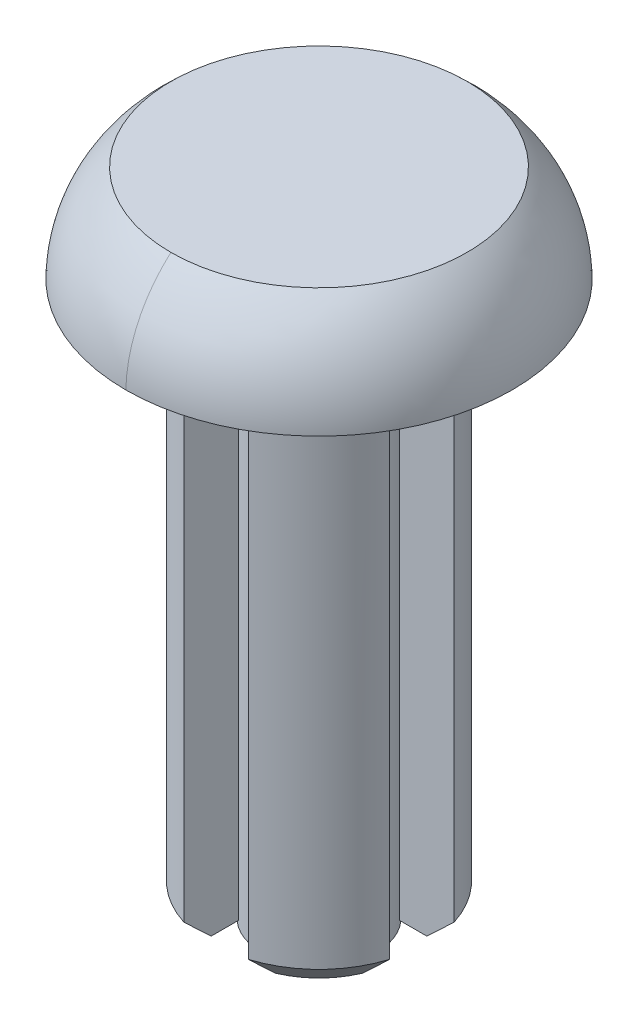
ISO-10303-21;
HEADER;
FILE_DESCRIPTION(('STEP AP214'),'2;1');
FILE_NAME('part.step','',(''),(''),'','','');
FILE_SCHEMA(('AUTOMOTIVE_DESIGN { 1 0 10303 214 1 1 1 1 }'));
ENDSEC;
DATA;
#1=APPLICATION_CONTEXT('core data for automotive mechanical design processes');
#2=APPLICATION_PROTOCOL_DEFINITION('international standard','automotive_design',2000,#1);
#3=PRODUCT_CONTEXT('',#1,'mechanical');
#4=PRODUCT('Part','Part','',(#3));
#5=PRODUCT_RELATED_PRODUCT_CATEGORY('part','',(#4));
#6=PRODUCT_DEFINITION_FORMATION('','',#4);
#7=PRODUCT_DEFINITION_CONTEXT('part definition',#1,'design');
#8=PRODUCT_DEFINITION('design','',#6,#7);
#9=PRODUCT_DEFINITION_SHAPE('','',#8);
#10=(LENGTH_UNIT() NAMED_UNIT(*) SI_UNIT(.MILLI.,.METRE.));
#11=(NAMED_UNIT(*) PLANE_ANGLE_UNIT() SI_UNIT($,.RADIAN.));
#12=(NAMED_UNIT(*) SI_UNIT($,.STERADIAN.) SOLID_ANGLE_UNIT());
#13=UNCERTAINTY_MEASURE_WITH_UNIT(LENGTH_MEASURE(1.E-05),#10,'distance_accuracy_value','');
#14=(GEOMETRIC_REPRESENTATION_CONTEXT(3) GLOBAL_UNCERTAINTY_ASSIGNED_CONTEXT((#13)) GLOBAL_UNIT_ASSIGNED_CONTEXT((#10,
#11,#12)) REPRESENTATION_CONTEXT('',''));
#15=CARTESIAN_POINT('',(0.,0.,0.));
#16=DIRECTION('',(0.,0.,1.));
#17=DIRECTION('',(1.,0.,0.));
#18=AXIS2_PLACEMENT_3D('',#15,#16,#17);
#19=CARTESIAN_POINT('',(0.,-11.4394,0.));
#20=DIRECTION('',(0.,1.,0.));
#21=DIRECTION('',(0.,0.,1.));
#22=AXIS2_PLACEMENT_3D('',#19,#20,#21);
#23=CONICAL_SURFACE('',#22,0.635,0.785398163397446);
#24=DIRECTION('',(0.,0.707106781186549,-0.707106781186546));
#25=VECTOR('',#24,1.);
#26=CARTESIAN_POINT('',(0.,-11.4394,-0.635));
#27=LINE('',#26,#25);
#28=CARTESIAN_POINT('',(0.,-11.4394,-0.635));
#29=VERTEX_POINT('',#28);
#30=CARTESIAN_POINT('',(0.,-10.9314,-1.143));
#31=VERTEX_POINT('',#30);
#32=EDGE_CURVE('E45',#29,#31,#27,.T.);
#33=ORIENTED_EDGE('',*,*,#32,.F.);
#34=CARTESIAN_POINT('',(0.,-11.4394,0.));
#35=DIRECTION('',(0.,-1.,0.));
#36=DIRECTION('',(0.,0.,-1.));
#37=AXIS2_PLACEMENT_3D('',#34,#35,#36);
#38=CIRCLE('',#37,0.635);
#39=CARTESIAN_POINT('',(0.,-11.4394,0.635));
#40=VERTEX_POINT('',#39);
#41=EDGE_CURVE('E30',#40,#29,#38,.T.);
#42=ORIENTED_EDGE('',*,*,#41,.F.);
#43=DIRECTION('',(0.,0.707106781186549,0.707106781186546));
#44=VECTOR('',#43,1.);
#45=CARTESIAN_POINT('',(0.,-11.4394,0.635));
#46=LINE('',#45,#44);
#47=CARTESIAN_POINT('',(0.,-10.9314,1.143));
#48=VERTEX_POINT('',#47);
#49=EDGE_CURVE('E10',#40,#48,#46,.T.);
#50=ORIENTED_EDGE('',*,*,#49,.T.);
#51=CARTESIAN_POINT('',(0.,-10.9314,0.));
#52=DIRECTION('',(0.,1.,0.));
#53=DIRECTION('',(0.,0.,-1.));
#54=AXIS2_PLACEMENT_3D('',#51,#52,#53);
#55=CIRCLE('',#54,1.143);
#56=EDGE_CURVE('E375',#31,#48,#55,.T.);
#57=ORIENTED_EDGE('',*,*,#56,.F.);
#58=EDGE_LOOP('',(#33,#42,#50,#57));
#59=FACE_BOUND('',#58,.T.);
#60=ADVANCED_FACE('F16',(#59),#23,.T.);
#61=CARTESIAN_POINT('',(0.,-11.4394,0.));
#62=DIRECTION('',(0.,-1.,0.));
#63=DIRECTION('',(0.,0.,-1.));
#64=AXIS2_PLACEMENT_3D('',#61,#62,#63);
#65=PLANE('',#64);
#66=ORIENTED_EDGE('',*,*,#41,.T.);
#67=CARTESIAN_POINT('',(0.,-11.4394,0.));
#68=DIRECTION('',(0.,-1.,0.));
#69=DIRECTION('',(0.,0.,-1.));
#70=AXIS2_PLACEMENT_3D('',#67,#68,#69);
#71=CIRCLE('',#70,0.635);
#72=EDGE_CURVE('E357',#29,#40,#71,.T.);
#73=ORIENTED_EDGE('',*,*,#72,.T.);
#74=EDGE_LOOP('',(#66,#73));
#75=FACE_BOUND('',#74,.T.);
#76=ADVANCED_FACE('F563',(#75),#65,.T.);
#77=CARTESIAN_POINT('',(0.,-11.4394,0.));
#78=DIRECTION('',(0.,1.,0.));
#79=DIRECTION('',(0.,0.,1.));
#80=AXIS2_PLACEMENT_3D('',#77,#78,#79);
#81=CYLINDRICAL_SURFACE('',#80,1.143);
#82=DIRECTION('',(0.,1.,0.));
#83=VECTOR('',#82,1.);
#84=CARTESIAN_POINT('',(0.,-11.4394,-1.143));
#85=LINE('',#84,#83);
#86=CARTESIAN_POINT('',(0.,-0.6444,-1.143));
#87=VERTEX_POINT('',#86);
#88=EDGE_CURVE('E394',#31,#87,#85,.T.);
#89=ORIENTED_EDGE('',*,*,#88,.F.);
#90=ORIENTED_EDGE('',*,*,#56,.T.);
#91=DIRECTION('',(0.,1.,0.));
#92=VECTOR('',#91,1.);
#93=CARTESIAN_POINT('',(0.,-11.4394,1.143));
#94=LINE('',#93,#92);
#95=CARTESIAN_POINT('',(0.,-0.6444,1.143));
#96=VERTEX_POINT('',#95);
#97=EDGE_CURVE('E376',#48,#96,#94,.T.);
#98=ORIENTED_EDGE('',*,*,#97,.T.);
#99=CARTESIAN_POINT('',(0.,-0.6444,0.));
#100=DIRECTION('',(0.,1.,0.));
#101=DIRECTION('',(0.,0.,-1.));
#102=AXIS2_PLACEMENT_3D('',#99,#100,#101);
#103=CIRCLE('',#102,1.143);
#104=CARTESIAN_POINT('',(-0.635,-0.6444,0.950380976240581));
#105=VERTEX_POINT('',#104);
#106=EDGE_CURVE('E414',#105,#96,#103,.T.);
#107=ORIENTED_EDGE('',*,*,#106,.F.);
#108=DIRECTION('',(0.,-1.,0.));
#109=VECTOR('',#108,1.);
#110=CARTESIAN_POINT('',(-0.635,-11.4394,0.950380976240581));
#111=LINE('',#110,#109);
#112=CARTESIAN_POINT('',(-0.635,-10.8044,0.950380976240581));
#113=VERTEX_POINT('',#112);
#114=EDGE_CURVE('E419',#105,#113,#111,.T.);
#115=ORIENTED_EDGE('',*,*,#114,.T.);
#116=CARTESIAN_POINT('',(0.,-10.8044,0.));
#117=DIRECTION('',(0.,1.,0.));
#118=DIRECTION('',(0.,0.,-1.));
#119=AXIS2_PLACEMENT_3D('',#116,#117,#118);
#120=CIRCLE('',#119,1.143);
#121=CARTESIAN_POINT('',(-0.950380976240581,-10.8044,0.635));
#122=VERTEX_POINT('',#121);
#123=EDGE_CURVE('E412',#122,#113,#120,.T.);
#124=ORIENTED_EDGE('',*,*,#123,.F.);
#125=DIRECTION('',(0.,1.,0.));
#126=VECTOR('',#125,1.);
#127=CARTESIAN_POINT('',(-0.950380976240581,-11.4394,0.635));
#128=LINE('',#127,#126);
#129=CARTESIAN_POINT('',(-0.950380976240581,-0.6444,0.635));
#130=VERTEX_POINT('',#129);
#131=EDGE_CURVE('E424',#122,#130,#128,.T.);
#132=ORIENTED_EDGE('',*,*,#131,.T.);
#133=CARTESIAN_POINT('',(0.,-0.6444,0.));
#134=DIRECTION('',(0.,1.,0.));
#135=DIRECTION('',(0.,0.,-1.));
#136=AXIS2_PLACEMENT_3D('',#133,#134,#135);
#137=CIRCLE('',#136,1.143);
#138=CARTESIAN_POINT('',(-0.950380976240581,-0.6444,-0.635));
#139=VERTEX_POINT('',#138);
#140=EDGE_CURVE('E340',#139,#130,#137,.T.);
#141=ORIENTED_EDGE('',*,*,#140,.F.);
#142=DIRECTION('',(0.,-1.,0.));
#143=VECTOR('',#142,1.);
#144=CARTESIAN_POINT('',(-0.950380976240581,-11.4394,-0.635));
#145=LINE('',#144,#143);
#146=CARTESIAN_POINT('',(-0.950380976240581,-10.8044,-0.635));
#147=VERTEX_POINT('',#146);
#148=EDGE_CURVE('E333',#139,#147,#145,.T.);
#149=ORIENTED_EDGE('',*,*,#148,.T.);
#150=CARTESIAN_POINT('',(0.,-10.8044,0.));
#151=DIRECTION('',(0.,1.,0.));
#152=DIRECTION('',(0.,0.,-1.));
#153=AXIS2_PLACEMENT_3D('',#150,#151,#152);
#154=CIRCLE('',#153,1.143);
#155=CARTESIAN_POINT('',(-0.635,-10.8044,-0.950380976240581));
#156=VERTEX_POINT('',#155);
#157=EDGE_CURVE('E389',#156,#147,#154,.T.);
#158=ORIENTED_EDGE('',*,*,#157,.F.);
#159=DIRECTION('',(0.,1.,0.));
#160=VECTOR('',#159,1.);
#161=CARTESIAN_POINT('',(-0.635,-11.4394,-0.950380976240581));
#162=LINE('',#161,#160);
#163=CARTESIAN_POINT('',(-0.635,-0.6444,-0.950380976240581));
#164=VERTEX_POINT('',#163);
#165=EDGE_CURVE('E757',#156,#164,#162,.T.);
#166=ORIENTED_EDGE('',*,*,#165,.T.);
#167=CARTESIAN_POINT('',(0.,-0.6444,0.));
#168=DIRECTION('',(0.,1.,0.));
#169=DIRECTION('',(0.,0.,-1.));
#170=AXIS2_PLACEMENT_3D('',#167,#168,#169);
#171=CIRCLE('',#170,1.143);
#172=EDGE_CURVE('E356',#87,#164,#171,.T.);
#173=ORIENTED_EDGE('',*,*,#172,.F.);
#174=EDGE_LOOP('',(#89,#90,#98,#107,#115,#124,#132,#141,#149,#158,#166,#173));
#175=FACE_BOUND('',#174,.T.);
#176=ADVANCED_FACE('F566',(#175),#81,.T.);
#177=CARTESIAN_POINT('',(0.,-11.4394,0.));
#178=DIRECTION('',(0.,1.,0.));
#179=DIRECTION('',(0.,0.,1.));
#180=AXIS2_PLACEMENT_3D('',#177,#178,#179);
#181=CONICAL_SURFACE('',#180,0.635,0.785398163397446);
#182=ORIENTED_EDGE('',*,*,#72,.F.);
#183=ORIENTED_EDGE('',*,*,#32,.T.);
#184=CARTESIAN_POINT('',(0.,-10.9314,0.));
#185=DIRECTION('',(0.,1.,0.));
#186=DIRECTION('',(0.,0.,-1.));
#187=AXIS2_PLACEMENT_3D('',#184,#185,#186);
#188=CIRCLE('',#187,1.143);
#189=EDGE_CURVE('E398',#48,#31,#188,.T.);
#190=ORIENTED_EDGE('',*,*,#189,.F.);
#191=ORIENTED_EDGE('',*,*,#49,.F.);
#192=EDGE_LOOP('',(#182,#183,#190,#191));
#193=FACE_BOUND('',#192,.T.);
#194=ADVANCED_FACE('F483',(#193),#181,.T.);
#195=CARTESIAN_POINT('',(-0.635,-0.6444,-0.635));
#196=DIRECTION('',(-1.,0.,0.));
#197=DIRECTION('',(0.,0.,1.));
#198=AXIS2_PLACEMENT_3D('',#195,#196,#197);
#199=PLANE('',#198);
#200=DIRECTION('',(0.,0.,-1.));
#201=VECTOR('',#200,1.);
#202=CARTESIAN_POINT('',(-0.635,-10.8044,-0.635));
#203=LINE('',#202,#201);
#204=CARTESIAN_POINT('',(-0.635,-10.8044,-1.48954542142898));
#205=VERTEX_POINT('',#204);
#206=EDGE_CURVE('E759',#156,#205,#203,.T.);
#207=ORIENTED_EDGE('',*,*,#206,.T.);
#208=CARTESIAN_POINT('',(-0.635,-10.8044,-1.48954542142898));
#209=CARTESIAN_POINT('',(-0.635,-10.5894198082781,-1.72324536131516));
#210=CARTESIAN_POINT('',(-0.635,-10.2964,-2.03026292940102));
#211=B_SPLINE_CURVE_WITH_KNOTS('',2,(#208,#209,#210),.UNSPECIFIED.,.F.,.F.,(3,3),(0.,1.),.UNSPECIFIED.);
#212=CARTESIAN_POINT('',(-0.635,-10.2964,-2.03026292940102));
#213=VERTEX_POINT('',#212);
#214=EDGE_CURVE('E466',#205,#213,#211,.T.);
#215=ORIENTED_EDGE('',*,*,#214,.T.);
#216=DIRECTION('',(0.,-1.,0.));
#217=VECTOR('',#216,1.);
#218=CARTESIAN_POINT('',(-0.635,-0.6444,-2.03026292940102));
#219=LINE('',#218,#217);
#220=CARTESIAN_POINT('',(-0.635,-0.6444,-2.03026292940102));
#221=VERTEX_POINT('',#220);
#222=EDGE_CURVE('E436',#221,#213,#219,.T.);
#223=ORIENTED_EDGE('',*,*,#222,.F.);
#224=DIRECTION('',(0.,0.,-1.));
#225=VECTOR('',#224,1.);
#226=CARTESIAN_POINT('',(-0.635,-0.6444,-0.635));
#227=LINE('',#226,#225);
#228=EDGE_CURVE('E400',#164,#221,#227,.T.);
#229=ORIENTED_EDGE('',*,*,#228,.F.);
#230=ORIENTED_EDGE('',*,*,#165,.F.);
#231=EDGE_LOOP('',(#207,#215,#223,#229,#230));
#232=FACE_BOUND('',#231,.T.);
#233=ADVANCED_FACE('F471',(#232),#199,.F.);
#234=CARTESIAN_POINT('',(0.,-0.6444,0.));
#235=DIRECTION('',(0.,-1.,0.));
#236=DIRECTION('',(0.,0.,-1.));
#237=AXIS2_PLACEMENT_3D('',#234,#235,#236);
#238=PLANE('',#237);
#239=DIRECTION('',(1.,0.,0.));
#240=VECTOR('',#239,1.);
#241=CARTESIAN_POINT('',(-2.03026292940101,-0.6444,-0.635));
#242=LINE('',#241,#240);
#243=CARTESIAN_POINT('',(-2.03026292940101,-0.6444,-0.635));
#244=VERTEX_POINT('',#243);
#245=EDGE_CURVE('E685',#244,#139,#242,.T.);
#246=ORIENTED_EDGE('',*,*,#245,.T.);
#247=ORIENTED_EDGE('',*,*,#140,.T.);
#248=DIRECTION('',(-1.,0.,0.));
#249=VECTOR('',#248,1.);
#250=CARTESIAN_POINT('',(-2.03026292940101,-0.6444,0.635));
#251=LINE('',#250,#249);
#252=CARTESIAN_POINT('',(-2.03026292940101,-0.6444,0.635));
#253=VERTEX_POINT('',#252);
#254=EDGE_CURVE('E337',#130,#253,#251,.T.);
#255=ORIENTED_EDGE('',*,*,#254,.T.);
#256=CARTESIAN_POINT('',(0.,-0.6444,0.));
#257=DIRECTION('',(0.,-1.,0.));
#258=DIRECTION('',(0.,0.,-1.));
#259=AXIS2_PLACEMENT_3D('',#256,#257,#258);
#260=CIRCLE('',#259,2.12725);
#261=EDGE_CURVE('E343',#253,#244,#260,.T.);
#262=ORIENTED_EDGE('',*,*,#261,.T.);
#263=EDGE_LOOP('',(#246,#247,#255,#262));
#264=FACE_BOUND('',#263,.T.);
#265=ADVANCED_FACE('F294',(#264),#238,.T.);
#266=CARTESIAN_POINT('',(-2.03026292940101,-0.6444,-0.635));
#267=DIRECTION('',(0.,0.,-1.));
#268=DIRECTION('',(0.,-1.,0.));
#269=AXIS2_PLACEMENT_3D('',#266,#267,#268);
#270=PLANE('',#269);
#271=DIRECTION('',(0.,-1.,0.));
#272=VECTOR('',#271,1.);
#273=CARTESIAN_POINT('',(-2.03026292940101,-0.6444,-0.635));
#274=LINE('',#273,#272);
#275=CARTESIAN_POINT('',(-2.03026292940101,-10.2964,-0.635));
#276=VERTEX_POINT('',#275);
#277=EDGE_CURVE('E438',#244,#276,#274,.T.);
#278=ORIENTED_EDGE('',*,*,#277,.T.);
#279=CARTESIAN_POINT('',(-2.03026292940101,-10.2964,-0.635));
#280=CARTESIAN_POINT('',(-1.72324536131495,-10.5894198082783,-0.635));
#281=CARTESIAN_POINT('',(-1.48954542142898,-10.8044,-0.635));
#282=B_SPLINE_CURVE_WITH_KNOTS('',2,(#279,#280,#281),.UNSPECIFIED.,.F.,.F.,(3,3),(0.,1.),.UNSPECIFIED.);
#283=CARTESIAN_POINT('',(-1.48954542142898,-10.8044,-0.635));
#284=VERTEX_POINT('',#283);
#285=EDGE_CURVE('E601',#276,#284,#282,.T.);
#286=ORIENTED_EDGE('',*,*,#285,.T.);
#287=DIRECTION('',(1.,0.,0.));
#288=VECTOR('',#287,1.);
#289=CARTESIAN_POINT('',(-2.03026292940101,-10.8044,-0.635));
#290=LINE('',#289,#288);
#291=EDGE_CURVE('E435',#284,#147,#290,.T.);
#292=ORIENTED_EDGE('',*,*,#291,.T.);
#293=ORIENTED_EDGE('',*,*,#148,.F.);
#294=ORIENTED_EDGE('',*,*,#245,.F.);
#295=EDGE_LOOP('',(#278,#286,#292,#293,#294));
#296=FACE_BOUND('',#295,.T.);
#297=ADVANCED_FACE('F555',(#296),#270,.F.);
#298=CARTESIAN_POINT('',(0.,-0.6444,0.));
#299=DIRECTION('',(0.,-1.,0.));
#300=DIRECTION('',(0.,0.,-1.));
#301=AXIS2_PLACEMENT_3D('',#298,#299,#300);
#302=PLANE('',#301);
#303=DIRECTION('',(0.,0.,1.));
#304=VECTOR('',#303,1.);
#305=CARTESIAN_POINT('',(0.635,-0.6444,-0.635));
#306=LINE('',#305,#304);
#307=CARTESIAN_POINT('',(0.635,-0.6444,-2.03026292940101));
#308=VERTEX_POINT('',#307);
#309=CARTESIAN_POINT('',(0.635,-0.6444,-0.950380976240581));
#310=VERTEX_POINT('',#309);
#311=EDGE_CURVE('E354',#308,#310,#306,.T.);
#312=ORIENTED_EDGE('',*,*,#311,.T.);
#313=CARTESIAN_POINT('',(0.,-0.6444,0.));
#314=DIRECTION('',(0.,1.,0.));
#315=DIRECTION('',(0.,0.,-1.));
#316=AXIS2_PLACEMENT_3D('',#313,#314,#315);
#317=CIRCLE('',#316,1.143);
#318=EDGE_CURVE('E351',#310,#87,#317,.T.);
#319=ORIENTED_EDGE('',*,*,#318,.T.);
#320=ORIENTED_EDGE('',*,*,#172,.T.);
#321=ORIENTED_EDGE('',*,*,#228,.T.);
#322=CARTESIAN_POINT('',(0.,-0.6444,0.));
#323=DIRECTION('',(0.,-1.,0.));
#324=DIRECTION('',(0.,0.,-1.));
#325=AXIS2_PLACEMENT_3D('',#322,#323,#324);
#326=CIRCLE('',#325,2.12725);
#327=CARTESIAN_POINT('',(0.,-0.6444,-2.12725));
#328=VERTEX_POINT('',#327);
#329=EDGE_CURVE('E379',#221,#328,#326,.T.);
#330=ORIENTED_EDGE('',*,*,#329,.T.);
#331=CARTESIAN_POINT('',(0.,-0.6444,0.));
#332=DIRECTION('',(0.,-1.,0.));
#333=DIRECTION('',(0.,0.,-1.));
#334=AXIS2_PLACEMENT_3D('',#331,#332,#333);
#335=CIRCLE('',#334,2.12725);
#336=EDGE_CURVE('E380',#328,#308,#335,.T.);
#337=ORIENTED_EDGE('',*,*,#336,.T.);
#338=EDGE_LOOP('',(#312,#319,#320,#321,#330,#337));
#339=FACE_BOUND('',#338,.T.);
#340=ADVANCED_FACE('F630',(#339),#302,.T.);
#341=CARTESIAN_POINT('',(-2.03026292940101,-0.6444,0.635));
#342=DIRECTION('',(0.,0.,1.));
#343=DIRECTION('',(1.,0.,0.));
#344=AXIS2_PLACEMENT_3D('',#341,#342,#343);
#345=PLANE('',#344);
#346=DIRECTION('',(-1.,0.,0.));
#347=VECTOR('',#346,1.);
#348=CARTESIAN_POINT('',(-2.03026292940101,-10.8044,0.635));
#349=LINE('',#348,#347);
#350=CARTESIAN_POINT('',(-1.48954542142898,-10.8044,0.635));
#351=VERTEX_POINT('',#350);
#352=EDGE_CURVE('E381',#122,#351,#349,.T.);
#353=ORIENTED_EDGE('',*,*,#352,.T.);
#354=CARTESIAN_POINT('',(-1.48954542142898,-10.8044,0.635));
#355=CARTESIAN_POINT('',(-1.72324536131537,-10.5894198082779,0.635));
#356=CARTESIAN_POINT('',(-2.03026292940101,-10.2964,0.635));
#357=B_SPLINE_CURVE_WITH_KNOTS('',2,(#354,#355,#356),.UNSPECIFIED.,.F.,.F.,(3,3),(0.,1.),.UNSPECIFIED.);
#358=CARTESIAN_POINT('',(-2.03026292940101,-10.2964,0.635));
#359=VERTEX_POINT('',#358);
#360=EDGE_CURVE('E518',#351,#359,#357,.T.);
#361=ORIENTED_EDGE('',*,*,#360,.T.);
#362=DIRECTION('',(0.,-1.,0.));
#363=VECTOR('',#362,1.);
#364=CARTESIAN_POINT('',(-2.03026292940101,-0.6444,0.635));
#365=LINE('',#364,#363);
#366=EDGE_CURVE('E651',#253,#359,#365,.T.);
#367=ORIENTED_EDGE('',*,*,#366,.F.);
#368=ORIENTED_EDGE('',*,*,#254,.F.);
#369=ORIENTED_EDGE('',*,*,#131,.F.);
#370=EDGE_LOOP('',(#353,#361,#367,#368,#369));
#371=FACE_BOUND('',#370,.T.);
#372=ADVANCED_FACE('F619',(#371),#345,.F.);
#373=CARTESIAN_POINT('',(-0.635,-0.6444,2.03026292940102));
#374=DIRECTION('',(-1.,0.,0.));
#375=DIRECTION('',(0.,1.,0.));
#376=AXIS2_PLACEMENT_3D('',#373,#374,#375);
#377=PLANE('',#376);
#378=DIRECTION('',(0.,-1.,0.));
#379=VECTOR('',#378,1.);
#380=CARTESIAN_POINT('',(-0.635,-0.6444,2.03026292940102));
#381=LINE('',#380,#379);
#382=CARTESIAN_POINT('',(-0.635,-0.6444,2.03026292940102));
#383=VERTEX_POINT('',#382);
#384=CARTESIAN_POINT('',(-0.635,-10.2964,2.03026292940102));
#385=VERTEX_POINT('',#384);
#386=EDGE_CURVE('E506',#383,#385,#381,.T.);
#387=ORIENTED_EDGE('',*,*,#386,.T.);
#388=CARTESIAN_POINT('',(-0.635,-10.2964,2.03026292940102));
#389=CARTESIAN_POINT('',(-0.635,-10.5894198082783,1.72324536131495));
#390=CARTESIAN_POINT('',(-0.635,-10.8044,1.48954542142898));
#391=B_SPLINE_CURVE_WITH_KNOTS('',2,(#388,#389,#390),.UNSPECIFIED.,.F.,.F.,(3,3),(0.,1.),.UNSPECIFIED.);
#392=CARTESIAN_POINT('',(-0.635,-10.8044,1.48954542142898));
#393=VERTEX_POINT('',#392);
#394=EDGE_CURVE('E519',#385,#393,#391,.T.);
#395=ORIENTED_EDGE('',*,*,#394,.T.);
#396=DIRECTION('',(0.,0.,-1.));
#397=VECTOR('',#396,1.);
#398=CARTESIAN_POINT('',(-0.635,-10.8044,2.03026292940102));
#399=LINE('',#398,#397);
#400=EDGE_CURVE('E420',#393,#113,#399,.T.);
#401=ORIENTED_EDGE('',*,*,#400,.T.);
#402=ORIENTED_EDGE('',*,*,#114,.F.);
#403=DIRECTION('',(0.,0.,-1.));
#404=VECTOR('',#403,1.);
#405=CARTESIAN_POINT('',(-0.635,-0.6444,2.03026292940102));
#406=LINE('',#405,#404);
#407=EDGE_CURVE('E409',#383,#105,#406,.T.);
#408=ORIENTED_EDGE('',*,*,#407,.F.);
#409=EDGE_LOOP('',(#387,#395,#401,#402,#408));
#410=FACE_BOUND('',#409,.T.);
#411=ADVANCED_FACE('F626',(#410),#377,.F.);
#412=CARTESIAN_POINT('',(0.,-11.4394,0.));
#413=DIRECTION('',(0.,1.,0.));
#414=DIRECTION('',(0.,0.,1.));
#415=AXIS2_PLACEMENT_3D('',#412,#413,#414);
#416=CYLINDRICAL_SURFACE('',#415,1.143);
#417=ORIENTED_EDGE('',*,*,#189,.T.);
#418=ORIENTED_EDGE('',*,*,#88,.T.);
#419=ORIENTED_EDGE('',*,*,#318,.F.);
#420=DIRECTION('',(0.,-1.,0.));
#421=VECTOR('',#420,1.);
#422=CARTESIAN_POINT('',(0.635,-11.4394,-0.950380976240581));
#423=LINE('',#422,#421);
#424=CARTESIAN_POINT('',(0.635,-10.8044,-0.950380976240581));
#425=VERTEX_POINT('',#424);
#426=EDGE_CURVE('E399',#310,#425,#423,.T.);
#427=ORIENTED_EDGE('',*,*,#426,.T.);
#428=CARTESIAN_POINT('',(0.,-10.8044,0.));
#429=DIRECTION('',(0.,1.,0.));
#430=DIRECTION('',(0.,0.,-1.));
#431=AXIS2_PLACEMENT_3D('',#428,#429,#430);
#432=CIRCLE('',#431,1.143);
#433=CARTESIAN_POINT('',(0.950380976240581,-10.8044,-0.635));
#434=VERTEX_POINT('',#433);
#435=EDGE_CURVE('E385',#434,#425,#432,.T.);
#436=ORIENTED_EDGE('',*,*,#435,.F.);
#437=DIRECTION('',(0.,1.,0.));
#438=VECTOR('',#437,1.);
#439=CARTESIAN_POINT('',(0.950380976240581,-11.4394,-0.635));
#440=LINE('',#439,#438);
#441=CARTESIAN_POINT('',(0.950380976240581,-0.6444,-0.635));
#442=VERTEX_POINT('',#441);
#443=EDGE_CURVE('E428',#434,#442,#440,.T.);
#444=ORIENTED_EDGE('',*,*,#443,.T.);
#445=CARTESIAN_POINT('',(0.,-0.6444,0.));
#446=DIRECTION('',(0.,1.,0.));
#447=DIRECTION('',(0.,0.,-1.));
#448=AXIS2_PLACEMENT_3D('',#445,#446,#447);
#449=CIRCLE('',#448,1.143);
#450=CARTESIAN_POINT('',(0.950380976240581,-0.6444,0.635));
#451=VERTEX_POINT('',#450);
#452=EDGE_CURVE('E345',#451,#442,#449,.T.);
#453=ORIENTED_EDGE('',*,*,#452,.F.);
#454=DIRECTION('',(0.,-1.,0.));
#455=VECTOR('',#454,1.);
#456=CARTESIAN_POINT('',(0.950380976240581,-11.4394,0.635));
#457=LINE('',#456,#455);
#458=CARTESIAN_POINT('',(0.950380976240581,-10.8044,0.635));
#459=VERTEX_POINT('',#458);
#460=EDGE_CURVE('E461',#451,#459,#457,.T.);
#461=ORIENTED_EDGE('',*,*,#460,.T.);
#462=CARTESIAN_POINT('',(0.,-10.8044,0.));
#463=DIRECTION('',(0.,1.,0.));
#464=DIRECTION('',(0.,0.,-1.));
#465=AXIS2_PLACEMENT_3D('',#462,#463,#464);
#466=CIRCLE('',#465,1.143);
#467=CARTESIAN_POINT('',(0.635,-10.8044,0.950380976240581));
#468=VERTEX_POINT('',#467);
#469=EDGE_CURVE('E688',#468,#459,#466,.T.);
#470=ORIENTED_EDGE('',*,*,#469,.F.);
#471=DIRECTION('',(0.,1.,0.));
#472=VECTOR('',#471,1.);
#473=CARTESIAN_POINT('',(0.635,-11.4394,0.950380976240581));
#474=LINE('',#473,#472);
#475=CARTESIAN_POINT('',(0.635,-0.6444,0.950380976240581));
#476=VERTEX_POINT('',#475);
#477=EDGE_CURVE('E735',#468,#476,#474,.T.);
#478=ORIENTED_EDGE('',*,*,#477,.T.);
#479=CARTESIAN_POINT('',(0.,-0.6444,0.));
#480=DIRECTION('',(0.,1.,0.));
#481=DIRECTION('',(0.,0.,-1.));
#482=AXIS2_PLACEMENT_3D('',#479,#480,#481);
#483=CIRCLE('',#482,1.143);
#484=EDGE_CURVE('E439',#96,#476,#483,.T.);
#485=ORIENTED_EDGE('',*,*,#484,.F.);
#486=ORIENTED_EDGE('',*,*,#97,.F.);
#487=EDGE_LOOP('',(#417,#418,#419,#427,#436,#444,#453,#461,#470,#478,#485,#486));
#488=FACE_BOUND('',#487,.T.);
#489=ADVANCED_FACE('F631',(#488),#416,.T.);
#490=CARTESIAN_POINT('',(0.,-10.8044,0.));
#491=DIRECTION('',(0.,-1.,0.));
#492=DIRECTION('',(0.,0.,-1.));
#493=AXIS2_PLACEMENT_3D('',#490,#491,#492);
#494=PLANE('',#493);
#495=ORIENTED_EDGE('',*,*,#291,.F.);
#496=CARTESIAN_POINT('',(0.,-10.8044,0.));
#497=DIRECTION('',(0.,-1.,0.));
#498=DIRECTION('',(0.,0.,-1.));
#499=AXIS2_PLACEMENT_3D('',#496,#497,#498);
#500=CIRCLE('',#499,1.61925);
#501=EDGE_CURVE('E391',#284,#205,#500,.T.);
#502=ORIENTED_EDGE('',*,*,#501,.T.);
#503=ORIENTED_EDGE('',*,*,#206,.F.);
#504=ORIENTED_EDGE('',*,*,#157,.T.);
#505=EDGE_LOOP('',(#495,#502,#503,#504));
#506=FACE_BOUND('',#505,.T.);
#507=ADVANCED_FACE('F482',(#506),#494,.T.);
#508=CARTESIAN_POINT('',(0.,-10.8044,0.));
#509=DIRECTION('',(0.,-1.,0.));
#510=DIRECTION('',(0.,0.,-1.));
#511=AXIS2_PLACEMENT_3D('',#508,#509,#510);
#512=PLANE('',#511);
#513=ORIENTED_EDGE('',*,*,#400,.F.);
#514=CARTESIAN_POINT('',(0.,-10.8044,0.));
#515=DIRECTION('',(0.,-1.,0.));
#516=DIRECTION('',(0.,0.,-1.));
#517=AXIS2_PLACEMENT_3D('',#514,#515,#516);
#518=CIRCLE('',#517,1.61925);
#519=EDGE_CURVE('E392',#393,#351,#518,.T.);
#520=ORIENTED_EDGE('',*,*,#519,.T.);
#521=ORIENTED_EDGE('',*,*,#352,.F.);
#522=ORIENTED_EDGE('',*,*,#123,.T.);
#523=EDGE_LOOP('',(#513,#520,#521,#522));
#524=FACE_BOUND('',#523,.T.);
#525=ADVANCED_FACE('F567',(#524),#512,.T.);
#526=CARTESIAN_POINT('',(0.,-0.6444,0.));
#527=DIRECTION('',(0.,-1.,0.));
#528=DIRECTION('',(0.,0.,-1.));
#529=AXIS2_PLACEMENT_3D('',#526,#527,#528);
#530=PLANE('',#529);
#531=ORIENTED_EDGE('',*,*,#407,.T.);
#532=ORIENTED_EDGE('',*,*,#106,.T.);
#533=ORIENTED_EDGE('',*,*,#484,.T.);
#534=DIRECTION('',(0.,0.,1.));
#535=VECTOR('',#534,1.);
#536=CARTESIAN_POINT('',(0.635,-0.6444,2.03026292940101));
#537=LINE('',#536,#535);
#538=CARTESIAN_POINT('',(0.635,-0.6444,2.03026292940101));
#539=VERTEX_POINT('',#538);
#540=EDGE_CURVE('E407',#476,#539,#537,.T.);
#541=ORIENTED_EDGE('',*,*,#540,.T.);
#542=CARTESIAN_POINT('',(0.,-0.6444,0.));
#543=DIRECTION('',(0.,-1.,0.));
#544=DIRECTION('',(0.,0.,-1.));
#545=AXIS2_PLACEMENT_3D('',#542,#543,#544);
#546=CIRCLE('',#545,2.12725);
#547=CARTESIAN_POINT('',(0.,-0.6444,2.12725));
#548=VERTEX_POINT('',#547);
#549=EDGE_CURVE('E404',#539,#548,#546,.T.);
#550=ORIENTED_EDGE('',*,*,#549,.T.);
#551=CARTESIAN_POINT('',(0.,-0.6444,0.));
#552=DIRECTION('',(0.,-1.,0.));
#553=DIRECTION('',(0.,0.,-1.));
#554=AXIS2_PLACEMENT_3D('',#551,#552,#553);
#555=CIRCLE('',#554,2.12725);
#556=EDGE_CURVE('E408',#548,#383,#555,.T.);
#557=ORIENTED_EDGE('',*,*,#556,.T.);
#558=EDGE_LOOP('',(#531,#532,#533,#541,#550,#557));
#559=FACE_BOUND('',#558,.T.);
#560=ADVANCED_FACE('F575',(#559),#530,.T.);
#561=CARTESIAN_POINT('',(0.,-10.8044,0.));
#562=DIRECTION('',(0.,1.,0.));
#563=DIRECTION('',(0.,0.,1.));
#564=AXIS2_PLACEMENT_3D('',#561,#562,#563);
#565=CONICAL_SURFACE('',#564,1.61925,0.785398163397449);
#566=ORIENTED_EDGE('',*,*,#285,.F.);
#567=CARTESIAN_POINT('',(0.,-10.2964,0.));
#568=DIRECTION('',(0.,1.,0.));
#569=DIRECTION('',(0.,0.,-1.));
#570=AXIS2_PLACEMENT_3D('',#567,#568,#569);
#571=CIRCLE('',#570,2.12725);
#572=EDGE_CURVE('E656',#213,#276,#571,.T.);
#573=ORIENTED_EDGE('',*,*,#572,.F.);
#574=ORIENTED_EDGE('',*,*,#214,.F.);
#575=ORIENTED_EDGE('',*,*,#501,.F.);
#576=EDGE_LOOP('',(#566,#573,#574,#575));
#577=FACE_BOUND('',#576,.T.);
#578=ADVANCED_FACE('F580',(#577),#565,.T.);
#579=CARTESIAN_POINT('',(0.,-10.8044,0.));
#580=DIRECTION('',(0.,1.,0.));
#581=DIRECTION('',(0.,0.,1.));
#582=AXIS2_PLACEMENT_3D('',#579,#580,#581);
#583=CYLINDRICAL_SURFACE('',#582,2.12725);
#584=DIRECTION('',(0.,1.,0.));
#585=VECTOR('',#584,1.);
#586=CARTESIAN_POINT('',(0.,-10.8044,-2.12725));
#587=LINE('',#586,#585);
#588=CARTESIAN_POINT('',(0.,0.905,-2.12725));
#589=VERTEX_POINT('',#588);
#590=EDGE_CURVE('E325',#328,#589,#587,.T.);
#591=ORIENTED_EDGE('',*,*,#590,.F.);
#592=ORIENTED_EDGE('',*,*,#329,.F.);
#593=ORIENTED_EDGE('',*,*,#222,.T.);
#594=ORIENTED_EDGE('',*,*,#572,.T.);
#595=ORIENTED_EDGE('',*,*,#277,.F.);
#596=ORIENTED_EDGE('',*,*,#261,.F.);
#597=ORIENTED_EDGE('',*,*,#366,.T.);
#598=CARTESIAN_POINT('',(0.,-10.2964,0.));
#599=DIRECTION('',(0.,1.,0.));
#600=DIRECTION('',(0.,0.,-1.));
#601=AXIS2_PLACEMENT_3D('',#598,#599,#600);
#602=CIRCLE('',#601,2.12725);
#603=EDGE_CURVE('E365',#359,#385,#602,.T.);
#604=ORIENTED_EDGE('',*,*,#603,.T.);
#605=ORIENTED_EDGE('',*,*,#386,.F.);
#606=ORIENTED_EDGE('',*,*,#556,.F.);
#607=DIRECTION('',(0.,1.,0.));
#608=VECTOR('',#607,1.);
#609=CARTESIAN_POINT('',(0.,-10.8044,2.12725));
#610=LINE('',#609,#608);
#611=CARTESIAN_POINT('',(0.,0.905,2.12725));
#612=VERTEX_POINT('',#611);
#613=EDGE_CURVE('E359',#548,#612,#610,.T.);
#614=ORIENTED_EDGE('',*,*,#613,.T.);
#615=CARTESIAN_POINT('',(0.,0.905,0.));
#616=DIRECTION('',(0.,-1.,0.));
#617=DIRECTION('',(0.,0.,1.));
#618=AXIS2_PLACEMENT_3D('',#615,#616,#617);
#619=CIRCLE('',#618,2.12725);
#620=EDGE_CURVE('E364',#612,#589,#619,.T.);
#621=ORIENTED_EDGE('',*,*,#620,.T.);
#622=EDGE_LOOP('',(#591,#592,#593,#594,#595,#596,#597,#604,#605,#606,#614,#621));
#623=FACE_BOUND('',#622,.T.);
#624=ADVANCED_FACE('F552',(#623),#583,.T.);
#625=CARTESIAN_POINT('',(0.635,-0.6444,-0.635));
#626=DIRECTION('',(1.,0.,0.));
#627=DIRECTION('',(0.,0.,1.));
#628=AXIS2_PLACEMENT_3D('',#625,#626,#627);
#629=PLANE('',#628);
#630=DIRECTION('',(0.,-1.,0.));
#631=VECTOR('',#630,1.);
#632=CARTESIAN_POINT('',(0.635,-0.6444,-2.03026292940101));
#633=LINE('',#632,#631);
#634=CARTESIAN_POINT('',(0.635,-10.2964,-2.03026292940101));
#635=VERTEX_POINT('',#634);
#636=EDGE_CURVE('E854',#308,#635,#633,.T.);
#637=ORIENTED_EDGE('',*,*,#636,.T.);
#638=CARTESIAN_POINT('',(0.635,-10.2964,-2.03026292940102));
#639=CARTESIAN_POINT('',(0.635,-10.5894198082784,-1.72324536131481));
#640=CARTESIAN_POINT('',(0.635,-10.8044,-1.48954542142897));
#641=B_SPLINE_CURVE_WITH_KNOTS('',2,(#638,#639,#640),.UNSPECIFIED.,.F.,.F.,(3,3),(0.,1.),.UNSPECIFIED.);
#642=CARTESIAN_POINT('',(0.635,-10.8044,-1.48954542142897));
#643=VERTEX_POINT('',#642);
#644=EDGE_CURVE('E534',#635,#643,#641,.T.);
#645=ORIENTED_EDGE('',*,*,#644,.T.);
#646=DIRECTION('',(0.,0.,1.));
#647=VECTOR('',#646,1.);
#648=CARTESIAN_POINT('',(0.635,-10.8044,-0.635));
#649=LINE('',#648,#647);
#650=EDGE_CURVE('E332',#643,#425,#649,.T.);
#651=ORIENTED_EDGE('',*,*,#650,.T.);
#652=ORIENTED_EDGE('',*,*,#426,.F.);
#653=ORIENTED_EDGE('',*,*,#311,.F.);
#654=EDGE_LOOP('',(#637,#645,#651,#652,#653));
#655=FACE_BOUND('',#654,.T.);
#656=ADVANCED_FACE('F541',(#655),#629,.F.);
#657=CARTESIAN_POINT('',(0.,-10.8044,0.));
#658=DIRECTION('',(0.,1.,0.));
#659=DIRECTION('',(0.,0.,1.));
#660=AXIS2_PLACEMENT_3D('',#657,#658,#659);
#661=CYLINDRICAL_SURFACE('',#660,2.12725);
#662=ORIENTED_EDGE('',*,*,#336,.F.);
#663=ORIENTED_EDGE('',*,*,#590,.T.);
#664=CARTESIAN_POINT('',(0.,0.905,0.));
#665=DIRECTION('',(0.,-1.,0.));
#666=DIRECTION('',(0.,0.,1.));
#667=AXIS2_PLACEMENT_3D('',#664,#665,#666);
#668=CIRCLE('',#667,2.12725);
#669=EDGE_CURVE('E316',#589,#612,#668,.T.);
#670=ORIENTED_EDGE('',*,*,#669,.T.);
#671=ORIENTED_EDGE('',*,*,#613,.F.);
#672=ORIENTED_EDGE('',*,*,#549,.F.);
#673=DIRECTION('',(0.,-1.,0.));
#674=VECTOR('',#673,1.);
#675=CARTESIAN_POINT('',(0.635,-0.6444,2.03026292940101));
#676=LINE('',#675,#674);
#677=CARTESIAN_POINT('',(0.635,-10.2964,2.03026292940101));
#678=VERTEX_POINT('',#677);
#679=EDGE_CURVE('E257',#539,#678,#676,.T.);
#680=ORIENTED_EDGE('',*,*,#679,.T.);
#681=CARTESIAN_POINT('',(0.,-10.2964,0.));
#682=DIRECTION('',(0.,1.,0.));
#683=DIRECTION('',(0.,0.,-1.));
#684=AXIS2_PLACEMENT_3D('',#681,#682,#683);
#685=CIRCLE('',#684,2.12725);
#686=CARTESIAN_POINT('',(2.03026292940101,-10.2964,0.635));
#687=VERTEX_POINT('',#686);
#688=EDGE_CURVE('E260',#678,#687,#685,.T.);
#689=ORIENTED_EDGE('',*,*,#688,.T.);
#690=DIRECTION('',(0.,-1.,0.));
#691=VECTOR('',#690,1.);
#692=CARTESIAN_POINT('',(2.03026292940101,-0.6444,0.635));
#693=LINE('',#692,#691);
#694=CARTESIAN_POINT('',(2.03026292940101,-0.6444,0.635));
#695=VERTEX_POINT('',#694);
#696=EDGE_CURVE('E241',#695,#687,#693,.T.);
#697=ORIENTED_EDGE('',*,*,#696,.F.);
#698=CARTESIAN_POINT('',(0.,-0.6444,0.));
#699=DIRECTION('',(0.,-1.,0.));
#700=DIRECTION('',(0.,0.,-1.));
#701=AXIS2_PLACEMENT_3D('',#698,#699,#700);
#702=CIRCLE('',#701,2.12725);
#703=CARTESIAN_POINT('',(2.03026292940101,-0.6444,-0.635));
#704=VERTEX_POINT('',#703);
#705=EDGE_CURVE('E744',#704,#695,#702,.T.);
#706=ORIENTED_EDGE('',*,*,#705,.F.);
#707=DIRECTION('',(0.,-1.,0.));
#708=VECTOR('',#707,1.);
#709=CARTESIAN_POINT('',(2.03026292940101,-0.6444,-0.635));
#710=LINE('',#709,#708);
#711=CARTESIAN_POINT('',(2.03026292940101,-10.2964,-0.635));
#712=VERTEX_POINT('',#711);
#713=EDGE_CURVE('E262',#704,#712,#710,.T.);
#714=ORIENTED_EDGE('',*,*,#713,.T.);
#715=CARTESIAN_POINT('',(0.,-10.2964,0.));
#716=DIRECTION('',(0.,1.,0.));
#717=DIRECTION('',(0.,0.,-1.));
#718=AXIS2_PLACEMENT_3D('',#715,#716,#717);
#719=CIRCLE('',#718,2.12725);
#720=EDGE_CURVE('E255',#712,#635,#719,.T.);
#721=ORIENTED_EDGE('',*,*,#720,.T.);
#722=ORIENTED_EDGE('',*,*,#636,.F.);
#723=EDGE_LOOP('',(#662,#663,#670,#671,#672,#680,#689,#697,#706,#714,#721,#722));
#724=FACE_BOUND('',#723,.T.);
#725=ADVANCED_FACE('F256',(#724),#661,.T.);
#726=CARTESIAN_POINT('',(0.,-10.8044,0.));
#727=DIRECTION('',(0.,1.,0.));
#728=DIRECTION('',(0.,0.,1.));
#729=AXIS2_PLACEMENT_3D('',#726,#727,#728);
#730=CONICAL_SURFACE('',#729,1.61925,0.785398163397446);
#731=ORIENTED_EDGE('',*,*,#394,.F.);
#732=ORIENTED_EDGE('',*,*,#603,.F.);
#733=ORIENTED_EDGE('',*,*,#360,.F.);
#734=ORIENTED_EDGE('',*,*,#519,.F.);
#735=EDGE_LOOP('',(#731,#732,#733,#734));
#736=FACE_BOUND('',#735,.T.);
#737=ADVANCED_FACE('F491',(#736),#730,.T.);
#738=CARTESIAN_POINT('',(0.635,-0.6444,0.635));
#739=DIRECTION('',(0.,0.,1.));
#740=DIRECTION('',(1.,0.,0.));
#741=AXIS2_PLACEMENT_3D('',#738,#739,#740);
#742=PLANE('',#741);
#743=ORIENTED_EDGE('',*,*,#696,.T.);
#744=CARTESIAN_POINT('',(2.03026292940102,-10.2964,0.635));
#745=CARTESIAN_POINT('',(1.72324536131493,-10.5894198082783,0.635));
#746=CARTESIAN_POINT('',(1.48954542142898,-10.8044,0.635));
#747=B_SPLINE_CURVE_WITH_KNOTS('',2,(#744,#745,#746),.UNSPECIFIED.,.F.,.F.,(3,3),(0.,1.),.UNSPECIFIED.);
#748=CARTESIAN_POINT('',(1.48954542142897,-10.8044,0.635));
#749=VERTEX_POINT('',#748);
#750=EDGE_CURVE('E246',#687,#749,#747,.T.);
#751=ORIENTED_EDGE('',*,*,#750,.T.);
#752=DIRECTION('',(-1.,0.,0.));
#753=VECTOR('',#752,1.);
#754=CARTESIAN_POINT('',(0.635,-10.8044,0.635));
#755=LINE('',#754,#753);
#756=EDGE_CURVE('E271',#749,#459,#755,.T.);
#757=ORIENTED_EDGE('',*,*,#756,.T.);
#758=ORIENTED_EDGE('',*,*,#460,.F.);
#759=DIRECTION('',(-1.,0.,0.));
#760=VECTOR('',#759,1.);
#761=CARTESIAN_POINT('',(0.635,-0.6444,0.635));
#762=LINE('',#761,#760);
#763=EDGE_CURVE('E253',#695,#451,#762,.T.);
#764=ORIENTED_EDGE('',*,*,#763,.F.);
#765=EDGE_LOOP('',(#743,#751,#757,#758,#764));
#766=FACE_BOUND('',#765,.T.);
#767=ADVANCED_FACE('F242',(#766),#742,.F.);
#768=CARTESIAN_POINT('',(0.,-0.6444,0.));
#769=DIRECTION('',(0.,-1.,0.));
#770=DIRECTION('',(0.,0.,-1.));
#771=AXIS2_PLACEMENT_3D('',#768,#769,#770);
#772=PLANE('',#771);
#773=ORIENTED_EDGE('',*,*,#763,.T.);
#774=ORIENTED_EDGE('',*,*,#452,.T.);
#775=DIRECTION('',(1.,0.,0.));
#776=VECTOR('',#775,1.);
#777=CARTESIAN_POINT('',(0.635,-0.6444,-0.635));
#778=LINE('',#777,#776);
#779=EDGE_CURVE('E456',#442,#704,#778,.T.);
#780=ORIENTED_EDGE('',*,*,#779,.T.);
#781=ORIENTED_EDGE('',*,*,#705,.T.);
#782=EDGE_LOOP('',(#773,#774,#780,#781));
#783=FACE_BOUND('',#782,.T.);
#784=ADVANCED_FACE('F1127',(#783),#772,.T.);
#785=CARTESIAN_POINT('',(0.635,-0.6444,-0.635));
#786=DIRECTION('',(0.,0.,-1.));
#787=DIRECTION('',(0.,-1.,0.));
#788=AXIS2_PLACEMENT_3D('',#785,#786,#787);
#789=PLANE('',#788);
#790=DIRECTION('',(1.,0.,0.));
#791=VECTOR('',#790,1.);
#792=CARTESIAN_POINT('',(0.635,-10.8044,-0.635));
#793=LINE('',#792,#791);
#794=CARTESIAN_POINT('',(1.48954542142897,-10.8044,-0.635));
#795=VERTEX_POINT('',#794);
#796=EDGE_CURVE('E709',#434,#795,#793,.T.);
#797=ORIENTED_EDGE('',*,*,#796,.T.);
#798=CARTESIAN_POINT('',(1.48954542142897,-10.8044,-0.635));
#799=CARTESIAN_POINT('',(1.72324536131537,-10.5894198082779,-0.635));
#800=CARTESIAN_POINT('',(2.03026292940102,-10.2964,-0.635));
#801=B_SPLINE_CURVE_WITH_KNOTS('',2,(#798,#799,#800),.UNSPECIFIED.,.F.,.F.,(3,3),(0.,1.),.UNSPECIFIED.);
#802=EDGE_CURVE('E315',#795,#712,#801,.T.);
#803=ORIENTED_EDGE('',*,*,#802,.T.);
#804=ORIENTED_EDGE('',*,*,#713,.F.);
#805=ORIENTED_EDGE('',*,*,#779,.F.);
#806=ORIENTED_EDGE('',*,*,#443,.F.);
#807=EDGE_LOOP('',(#797,#803,#804,#805,#806));
#808=FACE_BOUND('',#807,.T.);
#809=ADVANCED_FACE('F291',(#808),#789,.F.);
#810=CARTESIAN_POINT('',(0.635,-0.6444,2.03026292940101));
#811=DIRECTION('',(1.,0.,0.));
#812=DIRECTION('',(0.,1.,0.));
#813=AXIS2_PLACEMENT_3D('',#810,#811,#812);
#814=PLANE('',#813);
#815=DIRECTION('',(0.,0.,1.));
#816=VECTOR('',#815,1.);
#817=CARTESIAN_POINT('',(0.635,-10.8044,2.03026292940101));
#818=LINE('',#817,#816);
#819=CARTESIAN_POINT('',(0.635,-10.8044,1.48954542142898));
#820=VERTEX_POINT('',#819);
#821=EDGE_CURVE('E303',#468,#820,#818,.T.);
#822=ORIENTED_EDGE('',*,*,#821,.T.);
#823=CARTESIAN_POINT('',(0.635,-10.8044,1.48954542142897));
#824=CARTESIAN_POINT('',(0.635,-10.5894198082779,1.7232453613154));
#825=CARTESIAN_POINT('',(0.635,-10.2964,2.03026292940101));
#826=B_SPLINE_CURVE_WITH_KNOTS('',2,(#823,#824,#825),.UNSPECIFIED.,.F.,.F.,(3,3),(0.,1.),.UNSPECIFIED.);
#827=EDGE_CURVE('E311',#820,#678,#826,.T.);
#828=ORIENTED_EDGE('',*,*,#827,.T.);
#829=ORIENTED_EDGE('',*,*,#679,.F.);
#830=ORIENTED_EDGE('',*,*,#540,.F.);
#831=ORIENTED_EDGE('',*,*,#477,.F.);
#832=EDGE_LOOP('',(#822,#828,#829,#830,#831));
#833=FACE_BOUND('',#832,.T.);
#834=ADVANCED_FACE('F1118',(#833),#814,.F.);
#835=CARTESIAN_POINT('',(0.,-10.8044,0.));
#836=DIRECTION('',(0.,-1.,0.));
#837=DIRECTION('',(0.,0.,-1.));
#838=AXIS2_PLACEMENT_3D('',#835,#836,#837);
#839=PLANE('',#838);
#840=ORIENTED_EDGE('',*,*,#756,.F.);
#841=CARTESIAN_POINT('',(0.,-10.8044,0.));
#842=DIRECTION('',(0.,-1.,0.));
#843=DIRECTION('',(0.,0.,-1.));
#844=AXIS2_PLACEMENT_3D('',#841,#842,#843);
#845=CIRCLE('',#844,1.61925);
#846=EDGE_CURVE('E267',#749,#820,#845,.T.);
#847=ORIENTED_EDGE('',*,*,#846,.T.);
#848=ORIENTED_EDGE('',*,*,#821,.F.);
#849=ORIENTED_EDGE('',*,*,#469,.T.);
#850=EDGE_LOOP('',(#840,#847,#848,#849));
#851=FACE_BOUND('',#850,.T.);
#852=ADVANCED_FACE('F497',(#851),#839,.T.);
#853=CARTESIAN_POINT('',(0.,-10.8044,0.));
#854=DIRECTION('',(0.,-1.,0.));
#855=DIRECTION('',(0.,0.,-1.));
#856=AXIS2_PLACEMENT_3D('',#853,#854,#855);
#857=PLANE('',#856);
#858=ORIENTED_EDGE('',*,*,#650,.F.);
#859=CARTESIAN_POINT('',(0.,-10.8044,0.));
#860=DIRECTION('',(0.,-1.,0.));
#861=DIRECTION('',(0.,0.,-1.));
#862=AXIS2_PLACEMENT_3D('',#859,#860,#861);
#863=CIRCLE('',#862,1.61925);
#864=EDGE_CURVE('E387',#643,#795,#863,.T.);
#865=ORIENTED_EDGE('',*,*,#864,.T.);
#866=ORIENTED_EDGE('',*,*,#796,.F.);
#867=ORIENTED_EDGE('',*,*,#435,.T.);
#868=EDGE_LOOP('',(#858,#865,#866,#867));
#869=FACE_BOUND('',#868,.T.);
#870=ADVANCED_FACE('F1102',(#869),#857,.T.);
#871=CARTESIAN_POINT('',(0.,0.905,0.));
#872=DIRECTION('',(0.,1.,0.));
#873=DIRECTION('',(1.,0.,0.));
#874=AXIS2_PLACEMENT_3D('',#871,#872,#873);
#875=PLANE('',#874);
#876=CARTESIAN_POINT('',(0.,0.905,0.));
#877=DIRECTION('',(0.,1.,0.));
#878=DIRECTION('',(0.,0.,1.));
#879=AXIS2_PLACEMENT_3D('',#876,#877,#878);
#880=CIRCLE('',#879,2.49071484004883);
#881=CARTESIAN_POINT('',(0.,0.905,2.49071484004883));
#882=VERTEX_POINT('',#881);
#883=CARTESIAN_POINT('',(0.,0.905,-2.49071484004883));
#884=VERTEX_POINT('',#883);
#885=EDGE_CURVE('E402',#882,#884,#880,.T.);
#886=ORIENTED_EDGE('',*,*,#885,.F.);
#887=CARTESIAN_POINT('',(0.,0.905,0.));
#888=DIRECTION('',(0.,1.,0.));
#889=DIRECTION('',(0.,0.,1.));
#890=AXIS2_PLACEMENT_3D('',#887,#888,#889);
#891=CIRCLE('',#890,2.49071484004883);
#892=EDGE_CURVE('E450',#884,#882,#891,.T.);
#893=ORIENTED_EDGE('',*,*,#892,.F.);
#894=EDGE_LOOP('',(#886,#893));
#895=FACE_BOUND('',#894,.T.);
#896=ORIENTED_EDGE('',*,*,#620,.F.);
#897=ORIENTED_EDGE('',*,*,#669,.F.);
#898=EDGE_LOOP('',(#896,#897));
#899=FACE_BOUND('',#898,.T.);
#900=ADVANCED_FACE('F633',(#895,#899),#875,.F.);
#901=CARTESIAN_POINT('',(0.,-10.8044,0.));
#902=DIRECTION('',(0.,1.,0.));
#903=DIRECTION('',(0.,0.,1.));
#904=AXIS2_PLACEMENT_3D('',#901,#902,#903);
#905=CONICAL_SURFACE('',#904,1.61925,0.785398163397448);
#906=ORIENTED_EDGE('',*,*,#644,.F.);
#907=ORIENTED_EDGE('',*,*,#720,.F.);
#908=ORIENTED_EDGE('',*,*,#802,.F.);
#909=ORIENTED_EDGE('',*,*,#864,.F.);
#910=EDGE_LOOP('',(#906,#907,#908,#909));
#911=FACE_BOUND('',#910,.T.);
#912=ADVANCED_FACE('F295',(#911),#905,.T.);
#913=CARTESIAN_POINT('',(0.,-10.8044,0.));
#914=DIRECTION('',(0.,1.,0.));
#915=DIRECTION('',(0.,0.,1.));
#916=AXIS2_PLACEMENT_3D('',#913,#914,#915);
#917=CONICAL_SURFACE('',#916,1.61925,0.785398163397448);
#918=ORIENTED_EDGE('',*,*,#750,.F.);
#919=ORIENTED_EDGE('',*,*,#688,.F.);
#920=ORIENTED_EDGE('',*,*,#827,.F.);
#921=ORIENTED_EDGE('',*,*,#846,.F.);
#922=EDGE_LOOP('',(#918,#919,#920,#921));
#923=FACE_BOUND('',#922,.T.);
#924=ADVANCED_FACE('F270',(#923),#917,.T.);
#925=CARTESIAN_POINT('',(0.,-0.0595861521909685,0.));
#926=DIRECTION('',(0.,1.,0.));
#927=DIRECTION('',(0.,0.,1.));
#928=AXIS2_PLACEMENT_3D('',#925,#926,#927);
#929=DEGENERATE_TOROIDAL_SURFACE('',#928,1.19674395959077,1.61393527889813,.T.);
#930=CARTESIAN_POINT('',(0.,-0.0595861521909685,-1.19674395959077));
#931=DIRECTION('',(1.,0.,0.));
#932=DIRECTION('',(0.,0.,-1.));
#933=AXIS2_PLACEMENT_3D('',#930,#931,#932);
#934=CIRCLE('',#933,1.61393527889813);
#935=CARTESIAN_POINT('',(0.,-0.022795572894245,-2.81025985283354));
#936=VERTEX_POINT('',#935);
#937=EDGE_CURVE('E452',#936,#884,#934,.T.);
#938=ORIENTED_EDGE('',*,*,#937,.F.);
#939=CARTESIAN_POINT('',(0.,-0.022795572894245,0.));
#940=DIRECTION('',(0.,1.,0.));
#941=DIRECTION('',(0.,0.,1.));
#942=AXIS2_PLACEMENT_3D('',#939,#940,#941);
#943=CIRCLE('',#942,2.81025985283354);
#944=CARTESIAN_POINT('',(0.,-0.022795572894245,2.81025985283354));
#945=VERTEX_POINT('',#944);
#946=EDGE_CURVE('E455',#945,#936,#943,.T.);
#947=ORIENTED_EDGE('',*,*,#946,.F.);
#948=CARTESIAN_POINT('',(0.,-0.0595861521909685,1.19674395959077));
#949=DIRECTION('',(-1.,0.,0.));
#950=DIRECTION('',(0.,0.,1.));
#951=AXIS2_PLACEMENT_3D('',#948,#949,#950);
#952=CIRCLE('',#951,1.61393527889813);
#953=EDGE_CURVE('E390',#945,#882,#952,.T.);
#954=ORIENTED_EDGE('',*,*,#953,.T.);
#955=ORIENTED_EDGE('',*,*,#885,.T.);
#956=EDGE_LOOP('',(#938,#947,#954,#955));
#957=FACE_BOUND('',#956,.T.);
#958=ADVANCED_FACE('F286',(#957),#929,.F.);
#959=CARTESIAN_POINT('',(0.,-0.0595861521909685,0.));
#960=DIRECTION('',(0.,1.,0.));
#961=DIRECTION('',(0.,0.,1.));
#962=AXIS2_PLACEMENT_3D('',#959,#960,#961);
#963=DEGENERATE_TOROIDAL_SURFACE('',#962,1.19674395959077,1.61393527889813,.T.);
#964=CARTESIAN_POINT('',(0.,-0.022795572894245,0.));
#965=DIRECTION('',(0.,1.,0.));
#966=DIRECTION('',(0.,0.,1.));
#967=AXIS2_PLACEMENT_3D('',#964,#965,#966);
#968=CIRCLE('',#967,2.81025985283354);
#969=EDGE_CURVE('E347',#936,#945,#968,.T.);
#970=ORIENTED_EDGE('',*,*,#969,.F.);
#971=ORIENTED_EDGE('',*,*,#937,.T.);
#972=ORIENTED_EDGE('',*,*,#892,.T.);
#973=ORIENTED_EDGE('',*,*,#953,.F.);
#974=EDGE_LOOP('',(#970,#971,#972,#973));
#975=FACE_BOUND('',#974,.T.);
#976=ADVANCED_FACE('F486',(#975),#963,.F.);
#977=CARTESIAN_POINT('',(0.,0.,0.));
#978=DIRECTION('',(0.,1.,0.));
#979=DIRECTION('',(0.,0.,1.));
#980=AXIS2_PLACEMENT_3D('',#977,#978,#979);
#981=CONICAL_SURFACE('',#980,3.81,1.54799877919733);
#982=ORIENTED_EDGE('',*,*,#946,.T.);
#983=DIRECTION('',(0.,0.0227955728942449,-0.999740147166464));
#984=VECTOR('',#983,1.);
#985=CARTESIAN_POINT('',(0.,0.,-3.81));
#986=LINE('',#985,#984);
#987=CARTESIAN_POINT('',(0.,0.,-3.81));
#988=VERTEX_POINT('',#987);
#989=EDGE_CURVE('E783',#936,#988,#986,.T.);
#990=ORIENTED_EDGE('',*,*,#989,.T.);
#991=CARTESIAN_POINT('',(0.,0.,0.));
#992=DIRECTION('',(0.,1.,0.));
#993=DIRECTION('',(0.,0.,1.));
#994=AXIS2_PLACEMENT_3D('',#991,#992,#993);
#995=CIRCLE('',#994,3.81);
#996=CARTESIAN_POINT('',(0.,0.,3.81));
#997=VERTEX_POINT('',#996);
#998=EDGE_CURVE('E349',#997,#988,#995,.T.);
#999=ORIENTED_EDGE('',*,*,#998,.F.);
#1000=DIRECTION('',(0.,0.0227955728942449,0.999740147166464));
#1001=VECTOR('',#1000,1.);
#1002=CARTESIAN_POINT('',(0.,0.,3.81));
#1003=LINE('',#1002,#1001);
#1004=EDGE_CURVE('E341',#945,#997,#1003,.T.);
#1005=ORIENTED_EDGE('',*,*,#1004,.F.);
#1006=EDGE_LOOP('',(#982,#990,#999,#1005));
#1007=FACE_BOUND('',#1006,.T.);
#1008=ADVANCED_FACE('F487',(#1007),#981,.T.);
#1009=CARTESIAN_POINT('',(0.,0.,0.));
#1010=DIRECTION('',(0.,1.,0.));
#1011=DIRECTION('',(0.,0.,1.));
#1012=AXIS2_PLACEMENT_3D('',#1009,#1010,#1011);
#1013=CONICAL_SURFACE('',#1012,3.81,1.54799877919733);
#1014=ORIENTED_EDGE('',*,*,#989,.F.);
#1015=ORIENTED_EDGE('',*,*,#969,.T.);
#1016=ORIENTED_EDGE('',*,*,#1004,.T.);
#1017=CARTESIAN_POINT('',(0.,0.,0.));
#1018=DIRECTION('',(0.,1.,0.));
#1019=DIRECTION('',(0.,0.,1.));
#1020=AXIS2_PLACEMENT_3D('',#1017,#1018,#1019);
#1021=CIRCLE('',#1020,3.81);
#1022=EDGE_CURVE('E368',#988,#997,#1021,.T.);
#1023=ORIENTED_EDGE('',*,*,#1022,.F.);
#1024=EDGE_LOOP('',(#1014,#1015,#1016,#1023));
#1025=FACE_BOUND('',#1024,.T.);
#1026=ADVANCED_FACE('F551',(#1025),#1013,.T.);
#1027=CARTESIAN_POINT('',(0.,-0.0595861521909685,0.));
#1028=DIRECTION('',(0.,1.,0.));
#1029=DIRECTION('',(0.,0.,1.));
#1030=AXIS2_PLACEMENT_3D('',#1027,#1028,#1029);
#1031=DEGENERATE_TOROIDAL_SURFACE('',#1030,1.19674395959077,2.61393527889813,.T.);
#1032=ORIENTED_EDGE('',*,*,#998,.T.);
#1033=CARTESIAN_POINT('',(0.,-0.0595861521909685,-1.19674395959077));
#1034=DIRECTION('',(1.,0.,0.));
#1035=DIRECTION('',(0.,0.,-1.));
#1036=AXIS2_PLACEMENT_3D('',#1033,#1034,#1035);
#1037=CIRCLE('',#1036,2.61393527889813);
#1038=CARTESIAN_POINT('',(0.,1.905,-2.921));
#1039=VERTEX_POINT('',#1038);
#1040=EDGE_CURVE('E367',#988,#1039,#1037,.T.);
#1041=ORIENTED_EDGE('',*,*,#1040,.T.);
#1042=CARTESIAN_POINT('',(0.,1.905,0.));
#1043=DIRECTION('',(0.,1.,0.));
#1044=DIRECTION('',(0.,0.,1.));
#1045=AXIS2_PLACEMENT_3D('',#1042,#1043,#1044);
#1046=CIRCLE('',#1045,2.921);
#1047=CARTESIAN_POINT('',(0.,1.905,2.921));
#1048=VERTEX_POINT('',#1047);
#1049=EDGE_CURVE('E692',#1048,#1039,#1046,.T.);
#1050=ORIENTED_EDGE('',*,*,#1049,.F.);
#1051=CARTESIAN_POINT('',(0.,-0.0595861521909685,1.19674395959077));
#1052=DIRECTION('',(-1.,0.,0.));
#1053=DIRECTION('',(0.,0.,1.));
#1054=AXIS2_PLACEMENT_3D('',#1051,#1052,#1053);
#1055=CIRCLE('',#1054,2.61393527889813);
#1056=EDGE_CURVE('E371',#997,#1048,#1055,.T.);
#1057=ORIENTED_EDGE('',*,*,#1056,.F.);
#1058=EDGE_LOOP('',(#1032,#1041,#1050,#1057));
#1059=FACE_BOUND('',#1058,.T.);
#1060=ADVANCED_FACE('F557',(#1059),#1031,.T.);
#1061=CARTESIAN_POINT('',(0.,-0.0595861521909685,0.));
#1062=DIRECTION('',(0.,1.,0.));
#1063=DIRECTION('',(0.,0.,1.));
#1064=AXIS2_PLACEMENT_3D('',#1061,#1062,#1063);
#1065=DEGENERATE_TOROIDAL_SURFACE('',#1064,1.19674395959077,2.61393527889813,.T.);
#1066=ORIENTED_EDGE('',*,*,#1040,.F.);
#1067=ORIENTED_EDGE('',*,*,#1022,.T.);
#1068=ORIENTED_EDGE('',*,*,#1056,.T.);
#1069=CARTESIAN_POINT('',(0.,1.905,0.));
#1070=DIRECTION('',(0.,1.,0.));
#1071=DIRECTION('',(0.,0.,1.));
#1072=AXIS2_PLACEMENT_3D('',#1069,#1070,#1071);
#1073=CIRCLE('',#1072,2.921);
#1074=EDGE_CURVE('E695',#1039,#1048,#1073,.T.);
#1075=ORIENTED_EDGE('',*,*,#1074,.F.);
#1076=EDGE_LOOP('',(#1066,#1067,#1068,#1075));
#1077=FACE_BOUND('',#1076,.T.);
#1078=ADVANCED_FACE('F18',(#1077),#1065,.T.);
#1079=CARTESIAN_POINT('',(0.,1.905,0.));
#1080=DIRECTION('',(0.,1.,0.));
#1081=DIRECTION('',(1.,0.,0.));
#1082=AXIS2_PLACEMENT_3D('',#1079,#1080,#1081);
#1083=PLANE('',#1082);
#1084=ORIENTED_EDGE('',*,*,#1049,.T.);
#1085=ORIENTED_EDGE('',*,*,#1074,.T.);
#1086=EDGE_LOOP('',(#1084,#1085));
#1087=FACE_BOUND('',#1086,.T.);
#1088=ADVANCED_FACE('F1167',(#1087),#1083,.T.);
#1089=CLOSED_SHELL('',(#60,#76,#176,#194,#233,#265,#297,#340,#372,#411,#489,#507,#525,#560,#578,
#624,#656,#725,#737,#767,#784,#809,#834,#852,#870,#900,#912,#924,#958,#976,#1008,#1026,#1060,
#1078,#1088));
#1090=MANIFOLD_SOLID_BREP('B1',#1089);
#1091=ADVANCED_BREP_SHAPE_REPRESENTATION('',(#18,#1090),#14);
#1092=SHAPE_DEFINITION_REPRESENTATION(#9,#1091);
ENDSEC;
END-ISO-10303-21;
